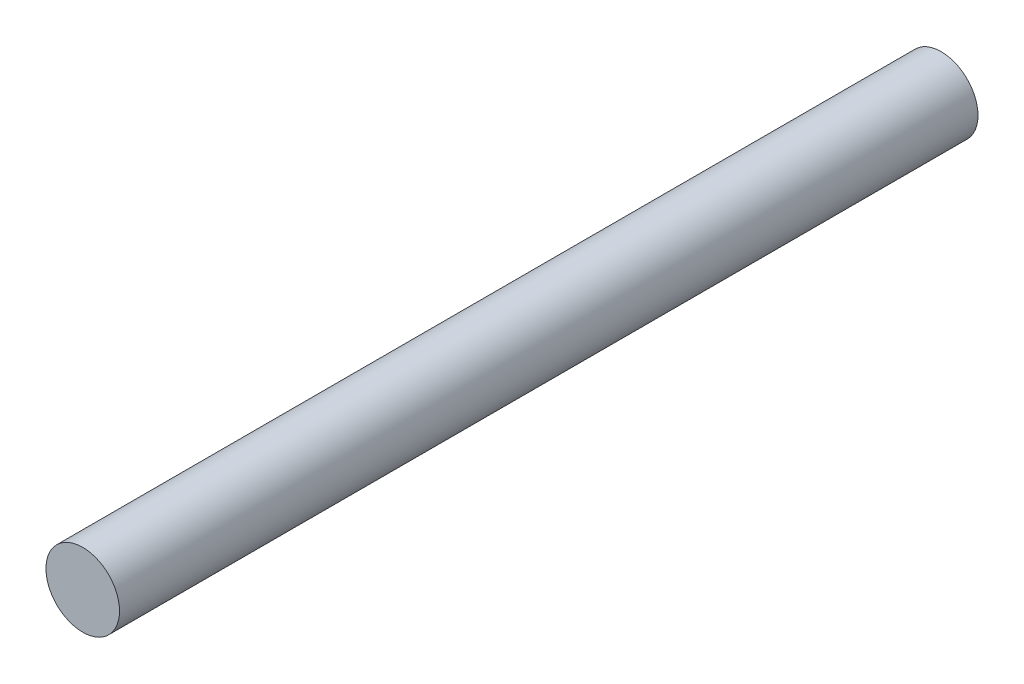
ISO-10303-21;
HEADER;
FILE_DESCRIPTION(('STEP AP214'),'2;1');
FILE_NAME('part.step','',(''),(''),'','','');
FILE_SCHEMA(('AUTOMOTIVE_DESIGN { 1 0 10303 214 1 1 1 1 }'));
ENDSEC;
DATA;
#1=APPLICATION_CONTEXT('core data for automotive mechanical design processes');
#2=APPLICATION_PROTOCOL_DEFINITION('international standard','automotive_design',2000,#1);
#3=PRODUCT_CONTEXT('',#1,'mechanical');
#4=PRODUCT('Part','Part','',(#3));
#5=PRODUCT_RELATED_PRODUCT_CATEGORY('part','',(#4));
#6=PRODUCT_DEFINITION_FORMATION('','',#4);
#7=PRODUCT_DEFINITION_CONTEXT('part definition',#1,'design');
#8=PRODUCT_DEFINITION('design','',#6,#7);
#9=PRODUCT_DEFINITION_SHAPE('','',#8);
#10=(LENGTH_UNIT() NAMED_UNIT(*) SI_UNIT(.MILLI.,.METRE.));
#11=(NAMED_UNIT(*) PLANE_ANGLE_UNIT() SI_UNIT($,.RADIAN.));
#12=(NAMED_UNIT(*) SI_UNIT($,.STERADIAN.) SOLID_ANGLE_UNIT());
#13=UNCERTAINTY_MEASURE_WITH_UNIT(LENGTH_MEASURE(1.E-05),#10,'distance_accuracy_value','');
#14=(GEOMETRIC_REPRESENTATION_CONTEXT(3) GLOBAL_UNCERTAINTY_ASSIGNED_CONTEXT((#13)) GLOBAL_UNIT_ASSIGNED_CONTEXT((#10,
#11,#12)) REPRESENTATION_CONTEXT('',''));
#15=CARTESIAN_POINT('',(0.,0.,0.));
#16=DIRECTION('',(0.,0.,1.));
#17=DIRECTION('',(1.,0.,0.));
#18=AXIS2_PLACEMENT_3D('',#15,#16,#17);
#19=CARTESIAN_POINT('',(0.,0.,700.));
#20=DIRECTION('',(0.,0.,-1.));
#21=DIRECTION('',(-1.,0.,0.));
#22=AXIS2_PLACEMENT_3D('',#19,#20,#21);
#23=CYLINDRICAL_SURFACE('',#22,30.);
#24=CARTESIAN_POINT('',(0.,0.,700.));
#25=DIRECTION('',(0.,0.,1.));
#26=DIRECTION('',(1.,0.,0.));
#27=AXIS2_PLACEMENT_3D('',#24,#25,#26);
#28=CIRCLE('',#27,30.);
#29=CARTESIAN_POINT('',(30.,0.,700.));
#30=VERTEX_POINT('',#29);
#31=EDGE_CURVE('E10',#30,#30,#28,.T.);
#32=ORIENTED_EDGE('',*,*,#31,.F.);
#33=EDGE_LOOP('',(#32));
#34=FACE_BOUND('',#33,.T.);
#35=CARTESIAN_POINT('',(0.,0.,0.));
#36=DIRECTION('',(0.,0.,1.));
#37=DIRECTION('',(1.,0.,0.));
#38=AXIS2_PLACEMENT_3D('',#35,#36,#37);
#39=CIRCLE('',#38,30.);
#40=CARTESIAN_POINT('',(30.,0.,0.));
#41=VERTEX_POINT('',#40);
#42=EDGE_CURVE('E34',#41,#41,#39,.T.);
#43=ORIENTED_EDGE('',*,*,#42,.T.);
#44=EDGE_LOOP('',(#43));
#45=FACE_BOUND('',#44,.T.);
#46=ADVANCED_FACE('F31',(#34,#45),#23,.T.);
#47=CARTESIAN_POINT('',(0.,0.,700.));
#48=DIRECTION('',(0.,0.,1.));
#49=DIRECTION('',(1.,0.,0.));
#50=AXIS2_PLACEMENT_3D('',#47,#48,#49);
#51=PLANE('',#50);
#52=ORIENTED_EDGE('',*,*,#31,.T.);
#53=EDGE_LOOP('',(#52));
#54=FACE_BOUND('',#53,.T.);
#55=ADVANCED_FACE('F46',(#54),#51,.T.);
#56=CARTESIAN_POINT('',(0.,0.,0.));
#57=DIRECTION('',(0.,0.,1.));
#58=DIRECTION('',(1.,0.,0.));
#59=AXIS2_PLACEMENT_3D('',#56,#57,#58);
#60=PLANE('',#59);
#61=ORIENTED_EDGE('',*,*,#42,.F.);
#62=EDGE_LOOP('',(#61));
#63=FACE_BOUND('',#62,.T.);
#64=ADVANCED_FACE('F44',(#63),#60,.F.);
#65=CLOSED_SHELL('',(#46,#55,#64));
#66=MANIFOLD_SOLID_BREP('B2',#65);
#67=ADVANCED_BREP_SHAPE_REPRESENTATION('',(#18,#66),#14);
#68=SHAPE_DEFINITION_REPRESENTATION(#9,#67);
ENDSEC;
END-ISO-10303-21;
